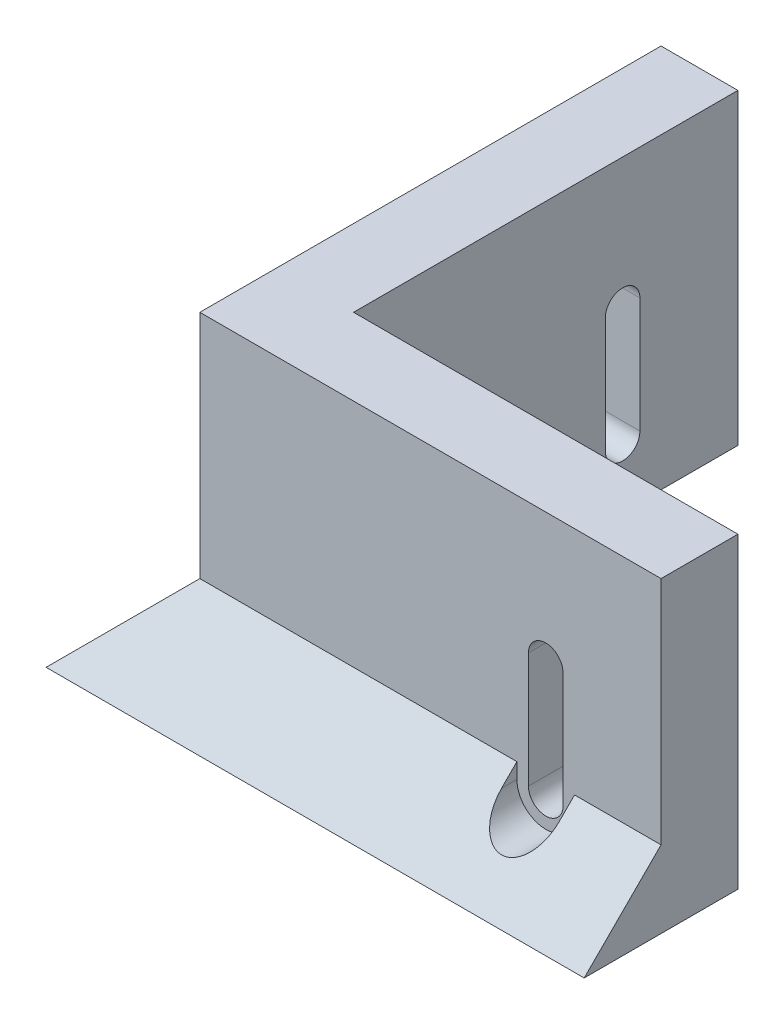
ISO-10303-21;
HEADER;
FILE_DESCRIPTION(('STEP AP214'),'2;1');
FILE_NAME('part.step','',(''),(''),'','','');
FILE_SCHEMA(('AUTOMOTIVE_DESIGN { 1 0 10303 214 1 1 1 1 }'));
ENDSEC;
DATA;
#1=APPLICATION_CONTEXT('core data for automotive mechanical design processes');
#2=APPLICATION_PROTOCOL_DEFINITION('international standard','automotive_design',2000,#1);
#3=PRODUCT_CONTEXT('',#1,'mechanical');
#4=PRODUCT('Part','Part','',(#3));
#5=PRODUCT_RELATED_PRODUCT_CATEGORY('part','',(#4));
#6=PRODUCT_DEFINITION_FORMATION('','',#4);
#7=PRODUCT_DEFINITION_CONTEXT('part definition',#1,'design');
#8=PRODUCT_DEFINITION('design','',#6,#7);
#9=PRODUCT_DEFINITION_SHAPE('','',#8);
#10=(LENGTH_UNIT() NAMED_UNIT(*) SI_UNIT(.MILLI.,.METRE.));
#11=(NAMED_UNIT(*) PLANE_ANGLE_UNIT() SI_UNIT($,.RADIAN.));
#12=(NAMED_UNIT(*) SI_UNIT($,.STERADIAN.) SOLID_ANGLE_UNIT());
#13=UNCERTAINTY_MEASURE_WITH_UNIT(LENGTH_MEASURE(1.E-05),#10,'distance_accuracy_value','');
#14=(GEOMETRIC_REPRESENTATION_CONTEXT(3) GLOBAL_UNCERTAINTY_ASSIGNED_CONTEXT((#13)) GLOBAL_UNIT_ASSIGNED_CONTEXT((#10,
#11,#12)) REPRESENTATION_CONTEXT('',''));
#15=CARTESIAN_POINT('',(0.,0.,0.));
#16=DIRECTION('',(0.,0.,1.));
#17=DIRECTION('',(1.,0.,0.));
#18=AXIS2_PLACEMENT_3D('',#15,#16,#17);
#19=CARTESIAN_POINT('',(-10.,40.,10.));
#20=DIRECTION('',(1.,0.,0.));
#21=DIRECTION('',(0.,0.,-1.));
#22=AXIS2_PLACEMENT_3D('',#19,#20,#21);
#23=PLANE('',#22);
#24=DIRECTION('',(0.,-1.,0.));
#25=VECTOR('',#24,1.);
#26=CARTESIAN_POINT('',(-10.,23.,-31.25));
#27=LINE('',#26,#25);
#28=CARTESIAN_POINT('',(-10.,9.99999999999995,-31.25));
#29=VERTEX_POINT('',#28);
#30=CARTESIAN_POINT('',(-10.,8.,-31.25));
#31=VERTEX_POINT('',#30);
#32=EDGE_CURVE('E199',#29,#31,#27,.T.);
#33=ORIENTED_EDGE('',*,*,#32,.F.);
#34=DIRECTION('',(0.,0.,-1.));
#35=VECTOR('',#34,1.);
#36=CARTESIAN_POINT('',(-10.,9.99999999999996,-50.));
#37=LINE('',#36,#35);
#38=CARTESIAN_POINT('',(-10.,9.99999999999996,10.));
#39=VERTEX_POINT('',#38);
#40=EDGE_CURVE('E316',#29,#39,#37,.F.);
#41=ORIENTED_EDGE('',*,*,#40,.T.);
#42=DIRECTION('',(0.,-1.,0.));
#43=VECTOR('',#42,1.);
#44=CARTESIAN_POINT('',(-10.,40.,10.));
#45=LINE('',#44,#43);
#46=CARTESIAN_POINT('',(-10.,40.,10.));
#47=VERTEX_POINT('',#46);
#48=EDGE_CURVE('E295',#47,#39,#45,.T.);
#49=ORIENTED_EDGE('',*,*,#48,.F.);
#50=DIRECTION('',(0.,0.,1.));
#51=VECTOR('',#50,1.);
#52=CARTESIAN_POINT('',(-10.,40.,10.));
#53=LINE('',#52,#51);
#54=CARTESIAN_POINT('',(-10.,40.,-50.));
#55=VERTEX_POINT('',#54);
#56=EDGE_CURVE('E275',#55,#47,#53,.T.);
#57=ORIENTED_EDGE('',*,*,#56,.F.);
#58=DIRECTION('',(0.,-1.,0.));
#59=VECTOR('',#58,1.);
#60=CARTESIAN_POINT('',(-10.,40.,-50.));
#61=LINE('',#60,#59);
#62=CARTESIAN_POINT('',(-10.,9.99999999999996,-50.));
#63=VERTEX_POINT('',#62);
#64=EDGE_CURVE('E298',#55,#63,#61,.T.);
#65=ORIENTED_EDGE('',*,*,#64,.T.);
#66=CARTESIAN_POINT('',(-10.,9.99999999999995,-38.75));
#67=VERTEX_POINT('',#66);
#68=EDGE_CURVE('E317',#63,#67,#37,.F.);
#69=ORIENTED_EDGE('',*,*,#68,.T.);
#70=DIRECTION('',(0.,1.,0.));
#71=VECTOR('',#70,1.);
#72=CARTESIAN_POINT('',(-10.,8.,-38.75));
#73=LINE('',#72,#71);
#74=CARTESIAN_POINT('',(-10.,8.,-38.75));
#75=VERTEX_POINT('',#74);
#76=EDGE_CURVE('E203',#75,#67,#73,.T.);
#77=ORIENTED_EDGE('',*,*,#76,.F.);
#78=CARTESIAN_POINT('',(-10.,8.,-35.));
#79=DIRECTION('',(1.,0.,0.));
#80=DIRECTION('',(0.,0.,-1.));
#81=AXIS2_PLACEMENT_3D('',#78,#79,#80);
#82=CIRCLE('',#81,3.75);
#83=EDGE_CURVE('E190',#31,#75,#82,.T.);
#84=ORIENTED_EDGE('',*,*,#83,.F.);
#85=EDGE_LOOP('',(#33,#41,#49,#57,#65,#69,#77,#84));
#86=FACE_BOUND('',#85,.T.);
#87=DIRECTION('',(0.,1.,0.));
#88=VECTOR('',#87,1.);
#89=CARTESIAN_POINT('',(-10.,23.,-37.25));
#90=LINE('',#89,#88);
#91=CARTESIAN_POINT('',(-10.,8.,-37.25));
#92=VERTEX_POINT('',#91);
#93=CARTESIAN_POINT('',(-10.,23.,-37.25));
#94=VERTEX_POINT('',#93);
#95=EDGE_CURVE('E213',#92,#94,#90,.T.);
#96=ORIENTED_EDGE('',*,*,#95,.T.);
#97=CARTESIAN_POINT('',(-10.,23.,-35.));
#98=DIRECTION('',(1.,0.,0.));
#99=DIRECTION('',(0.,0.,-1.));
#100=AXIS2_PLACEMENT_3D('',#97,#98,#99);
#101=CIRCLE('',#100,2.25);
#102=CARTESIAN_POINT('',(-10.,23.,-32.75));
#103=VERTEX_POINT('',#102);
#104=EDGE_CURVE('E195',#94,#103,#101,.T.);
#105=ORIENTED_EDGE('',*,*,#104,.T.);
#106=DIRECTION('',(0.,-1.,0.));
#107=VECTOR('',#106,1.);
#108=CARTESIAN_POINT('',(-10.,23.,-32.75));
#109=LINE('',#108,#107);
#110=CARTESIAN_POINT('',(-10.,8.,-32.75));
#111=VERTEX_POINT('',#110);
#112=EDGE_CURVE('E217',#103,#111,#109,.T.);
#113=ORIENTED_EDGE('',*,*,#112,.T.);
#114=CARTESIAN_POINT('',(-10.,8.,-35.));
#115=DIRECTION('',(1.,0.,0.));
#116=DIRECTION('',(0.,0.,-1.));
#117=AXIS2_PLACEMENT_3D('',#114,#115,#116);
#118=CIRCLE('',#117,2.25);
#119=EDGE_CURVE('E215',#111,#92,#118,.T.);
#120=ORIENTED_EDGE('',*,*,#119,.T.);
#121=EDGE_LOOP('',(#96,#105,#113,#120));
#122=FACE_BOUND('',#121,.T.);
#123=ADVANCED_FACE('F39',(#86,#122),#23,.F.);
#124=CARTESIAN_POINT('',(0.,40.,0.));
#125=DIRECTION('',(-1.,0.,0.));
#126=DIRECTION('',(0.,0.,1.));
#127=AXIS2_PLACEMENT_3D('',#124,#125,#126);
#128=PLANE('',#127);
#129=DIRECTION('',(0.,0.,-1.));
#130=VECTOR('',#129,1.);
#131=CARTESIAN_POINT('',(0.,0.,0.));
#132=LINE('',#131,#130);
#133=CARTESIAN_POINT('',(0.,0.,0.));
#134=VERTEX_POINT('',#133);
#135=CARTESIAN_POINT('',(0.,0.,-50.));
#136=VERTEX_POINT('',#135);
#137=EDGE_CURVE('E285',#134,#136,#132,.T.);
#138=ORIENTED_EDGE('',*,*,#137,.T.);
#139=DIRECTION('',(0.,-1.,0.));
#140=VECTOR('',#139,1.);
#141=CARTESIAN_POINT('',(0.,40.,-50.));
#142=LINE('',#141,#140);
#143=CARTESIAN_POINT('',(0.,40.,-50.));
#144=VERTEX_POINT('',#143);
#145=EDGE_CURVE('E300',#144,#136,#142,.T.);
#146=ORIENTED_EDGE('',*,*,#145,.F.);
#147=DIRECTION('',(0.,0.,-1.));
#148=VECTOR('',#147,1.);
#149=CARTESIAN_POINT('',(0.,40.,0.));
#150=LINE('',#149,#148);
#151=CARTESIAN_POINT('',(0.,40.,0.));
#152=VERTEX_POINT('',#151);
#153=EDGE_CURVE('E270',#152,#144,#150,.T.);
#154=ORIENTED_EDGE('',*,*,#153,.F.);
#155=DIRECTION('',(0.,-1.,0.));
#156=VECTOR('',#155,1.);
#157=CARTESIAN_POINT('',(0.,40.,0.));
#158=LINE('',#157,#156);
#159=EDGE_CURVE('E303',#152,#134,#158,.T.);
#160=ORIENTED_EDGE('',*,*,#159,.T.);
#161=EDGE_LOOP('',(#138,#146,#154,#160));
#162=FACE_BOUND('',#161,.T.);
#163=CARTESIAN_POINT('',(0.,23.,-35.));
#164=DIRECTION('',(-1.,0.,0.));
#165=DIRECTION('',(0.,0.,1.));
#166=AXIS2_PLACEMENT_3D('',#163,#164,#165);
#167=CIRCLE('',#166,2.25);
#168=CARTESIAN_POINT('',(0.,23.,-37.25));
#169=VERTEX_POINT('',#168);
#170=CARTESIAN_POINT('',(0.,23.,-32.75));
#171=VERTEX_POINT('',#170);
#172=EDGE_CURVE('E346',#169,#171,#167,.F.);
#173=ORIENTED_EDGE('',*,*,#172,.F.);
#174=DIRECTION('',(0.,1.,0.));
#175=VECTOR('',#174,1.);
#176=CARTESIAN_POINT('',(0.,40.,-37.25));
#177=LINE('',#176,#175);
#178=CARTESIAN_POINT('',(0.,8.,-37.25));
#179=VERTEX_POINT('',#178);
#180=EDGE_CURVE('E340',#179,#169,#177,.T.);
#181=ORIENTED_EDGE('',*,*,#180,.F.);
#182=CARTESIAN_POINT('',(0.,8.,-35.));
#183=DIRECTION('',(-1.,0.,0.));
#184=DIRECTION('',(0.,0.,1.));
#185=AXIS2_PLACEMENT_3D('',#182,#183,#184);
#186=CIRCLE('',#185,2.25);
#187=CARTESIAN_POINT('',(0.,8.,-32.75));
#188=VERTEX_POINT('',#187);
#189=EDGE_CURVE('E342',#188,#179,#186,.F.);
#190=ORIENTED_EDGE('',*,*,#189,.F.);
#191=DIRECTION('',(0.,-1.,0.));
#192=VECTOR('',#191,1.);
#193=CARTESIAN_POINT('',(0.,40.,-32.75));
#194=LINE('',#193,#192);
#195=EDGE_CURVE('E344',#171,#188,#194,.T.);
#196=ORIENTED_EDGE('',*,*,#195,.F.);
#197=EDGE_LOOP('',(#173,#181,#190,#196));
#198=FACE_BOUND('',#197,.T.);
#199=ADVANCED_FACE('F408',(#162,#198),#128,.F.);
#200=CARTESIAN_POINT('',(-20.,0.,20.));
#201=DIRECTION('',(0.,0.707106781186549,0.707106781186546));
#202=DIRECTION('',(0.,-0.707106781186546,0.707106781186549));
#203=AXIS2_PLACEMENT_3D('',#200,#201,#202);
#204=PLANE('',#203);
#205=DIRECTION('',(1.,0.,0.));
#206=VECTOR('',#205,1.);
#207=CARTESIAN_POINT('',(-10.,9.99999999999996,10.));
#208=LINE('',#207,#206);
#209=CARTESIAN_POINT('',(50.,9.99999999999996,10.));
#210=VERTEX_POINT('',#209);
#211=CARTESIAN_POINT('',(38.75,9.99999999999996,10.));
#212=VERTEX_POINT('',#211);
#213=EDGE_CURVE('E313',#210,#212,#208,.F.);
#214=ORIENTED_EDGE('',*,*,#213,.T.);
#215=DIRECTION('',(0.,-0.707106781186546,0.707106781186549));
#216=VECTOR('',#215,1.);
#217=CARTESIAN_POINT('',(38.75,0.,20.));
#218=LINE('',#217,#216);
#219=CARTESIAN_POINT('',(38.75,8.,12.));
#220=VERTEX_POINT('',#219);
#221=EDGE_CURVE('E337',#212,#220,#218,.T.);
#222=ORIENTED_EDGE('',*,*,#221,.T.);
#223=CARTESIAN_POINT('',(35.,8.,12.));
#224=DIRECTION('',(0.,0.707106781186549,0.707106781186546));
#225=DIRECTION('',(0.,0.707106781186546,-0.707106781186549));
#226=AXIS2_PLACEMENT_3D('',#223,#224,#225);
#227=ELLIPSE('',#226,5.30330085889912,3.75);
#228=CARTESIAN_POINT('',(31.25,8.,12.));
#229=VERTEX_POINT('',#228);
#230=EDGE_CURVE('E334',#220,#229,#227,.F.);
#231=ORIENTED_EDGE('',*,*,#230,.T.);
#232=DIRECTION('',(0.,0.707106781186546,-0.707106781186549));
#233=VECTOR('',#232,1.);
#234=CARTESIAN_POINT('',(31.25,0.,20.));
#235=LINE('',#234,#233);
#236=CARTESIAN_POINT('',(31.25,9.99999999999996,10.));
#237=VERTEX_POINT('',#236);
#238=EDGE_CURVE('E331',#229,#237,#235,.T.);
#239=ORIENTED_EDGE('',*,*,#238,.T.);
#240=EDGE_CURVE('E306',#237,#39,#208,.F.);
#241=ORIENTED_EDGE('',*,*,#240,.T.);
#242=DIRECTION('',(-0.577350269189627,-0.577350269189624,0.577350269189627));
#243=VECTOR('',#242,1.);
#244=CARTESIAN_POINT('',(-20.,0.,20.));
#245=LINE('',#244,#243);
#246=CARTESIAN_POINT('',(-20.,0.,20.));
#247=VERTEX_POINT('',#246);
#248=EDGE_CURVE('E307',#39,#247,#245,.T.);
#249=ORIENTED_EDGE('',*,*,#248,.T.);
#250=DIRECTION('',(-1.,0.,0.));
#251=VECTOR('',#250,1.);
#252=CARTESIAN_POINT('',(-20.,0.,20.));
#253=LINE('',#252,#251);
#254=CARTESIAN_POINT('',(50.,0.,20.));
#255=VERTEX_POINT('',#254);
#256=EDGE_CURVE('E255',#255,#247,#253,.T.);
#257=ORIENTED_EDGE('',*,*,#256,.F.);
#258=DIRECTION('',(0.,-0.707106781186546,0.707106781186549));
#259=VECTOR('',#258,1.);
#260=CARTESIAN_POINT('',(50.,0.,20.));
#261=LINE('',#260,#259);
#262=EDGE_CURVE('E266',#210,#255,#261,.T.);
#263=ORIENTED_EDGE('',*,*,#262,.F.);
#264=EDGE_LOOP('',(#214,#222,#231,#239,#241,#249,#257,#263));
#265=FACE_BOUND('',#264,.T.);
#266=ADVANCED_FACE('F41',(#265),#204,.T.);
#267=CARTESIAN_POINT('',(-10.,40.,10.));
#268=DIRECTION('',(0.,0.,-1.));
#269=DIRECTION('',(-1.,0.,0.));
#270=AXIS2_PLACEMENT_3D('',#267,#268,#269);
#271=PLANE('',#270);
#272=DIRECTION('',(0.,1.,0.));
#273=VECTOR('',#272,1.);
#274=CARTESIAN_POINT('',(38.75,8.,10.));
#275=LINE('',#274,#273);
#276=CARTESIAN_POINT('',(38.75,8.,10.));
#277=VERTEX_POINT('',#276);
#278=EDGE_CURVE('E231',#277,#212,#275,.T.);
#279=ORIENTED_EDGE('',*,*,#278,.T.);
#280=ORIENTED_EDGE('',*,*,#213,.F.);
#281=DIRECTION('',(0.,-1.,0.));
#282=VECTOR('',#281,1.);
#283=CARTESIAN_POINT('',(50.,40.,10.));
#284=LINE('',#283,#282);
#285=CARTESIAN_POINT('',(50.,40.,10.));
#286=VERTEX_POINT('',#285);
#287=EDGE_CURVE('E293',#286,#210,#284,.T.);
#288=ORIENTED_EDGE('',*,*,#287,.F.);
#289=DIRECTION('',(1.,0.,0.));
#290=VECTOR('',#289,1.);
#291=CARTESIAN_POINT('',(-10.,40.,10.));
#292=LINE('',#291,#290);
#293=EDGE_CURVE('E277',#47,#286,#292,.T.);
#294=ORIENTED_EDGE('',*,*,#293,.F.);
#295=ORIENTED_EDGE('',*,*,#48,.T.);
#296=ORIENTED_EDGE('',*,*,#240,.F.);
#297=DIRECTION('',(0.,-1.,0.));
#298=VECTOR('',#297,1.);
#299=CARTESIAN_POINT('',(31.25,23.,10.));
#300=LINE('',#299,#298);
#301=CARTESIAN_POINT('',(31.25,8.,10.));
#302=VERTEX_POINT('',#301);
#303=EDGE_CURVE('E234',#237,#302,#300,.T.);
#304=ORIENTED_EDGE('',*,*,#303,.T.);
#305=CARTESIAN_POINT('',(35.,8.,10.));
#306=DIRECTION('',(0.,0.,1.));
#307=DIRECTION('',(1.,0.,0.));
#308=AXIS2_PLACEMENT_3D('',#305,#306,#307);
#309=CIRCLE('',#308,3.75);
#310=EDGE_CURVE('E222',#302,#277,#309,.T.);
#311=ORIENTED_EDGE('',*,*,#310,.T.);
#312=EDGE_LOOP('',(#279,#280,#288,#294,#295,#296,#304,#311));
#313=FACE_BOUND('',#312,.T.);
#314=DIRECTION('',(0.,1.,0.));
#315=VECTOR('',#314,1.);
#316=CARTESIAN_POINT('',(37.25,23.,10.));
#317=LINE('',#316,#315);
#318=CARTESIAN_POINT('',(37.25,8.,10.));
#319=VERTEX_POINT('',#318);
#320=CARTESIAN_POINT('',(37.25,23.,10.));
#321=VERTEX_POINT('',#320);
#322=EDGE_CURVE('E249',#319,#321,#317,.T.);
#323=ORIENTED_EDGE('',*,*,#322,.F.);
#324=CARTESIAN_POINT('',(35.,8.,10.));
#325=DIRECTION('',(0.,0.,1.));
#326=DIRECTION('',(1.,0.,0.));
#327=AXIS2_PLACEMENT_3D('',#324,#325,#326);
#328=CIRCLE('',#327,2.25);
#329=CARTESIAN_POINT('',(32.75,8.,10.));
#330=VERTEX_POINT('',#329);
#331=EDGE_CURVE('E246',#330,#319,#328,.T.);
#332=ORIENTED_EDGE('',*,*,#331,.F.);
#333=DIRECTION('',(0.,-1.,0.));
#334=VECTOR('',#333,1.);
#335=CARTESIAN_POINT('',(32.75,23.,10.));
#336=LINE('',#335,#334);
#337=CARTESIAN_POINT('',(32.75,23.,10.));
#338=VERTEX_POINT('',#337);
#339=EDGE_CURVE('E244',#338,#330,#336,.T.);
#340=ORIENTED_EDGE('',*,*,#339,.F.);
#341=CARTESIAN_POINT('',(35.,23.,10.));
#342=DIRECTION('',(0.,0.,1.));
#343=DIRECTION('',(1.,0.,0.));
#344=AXIS2_PLACEMENT_3D('',#341,#342,#343);
#345=CIRCLE('',#344,2.25);
#346=EDGE_CURVE('E241',#321,#338,#345,.T.);
#347=ORIENTED_EDGE('',*,*,#346,.F.);
#348=EDGE_LOOP('',(#323,#332,#340,#347));
#349=FACE_BOUND('',#348,.T.);
#350=ADVANCED_FACE('F365',(#313,#349),#271,.F.);
#351=CARTESIAN_POINT('',(0.,40.,0.));
#352=DIRECTION('',(0.,0.,1.));
#353=DIRECTION('',(1.,0.,0.));
#354=AXIS2_PLACEMENT_3D('',#351,#352,#353);
#355=PLANE('',#354);
#356=DIRECTION('',(0.,1.,0.));
#357=VECTOR('',#356,1.);
#358=CARTESIAN_POINT('',(37.25,40.,0.));
#359=LINE('',#358,#357);
#360=CARTESIAN_POINT('',(37.25,8.,0.));
#361=VERTEX_POINT('',#360);
#362=CARTESIAN_POINT('',(37.25,23.,0.));
#363=VERTEX_POINT('',#362);
#364=EDGE_CURVE('E325',#361,#363,#359,.T.);
#365=ORIENTED_EDGE('',*,*,#364,.T.);
#366=CARTESIAN_POINT('',(35.,23.,0.));
#367=DIRECTION('',(0.,0.,1.));
#368=DIRECTION('',(1.,0.,0.));
#369=AXIS2_PLACEMENT_3D('',#366,#367,#368);
#370=CIRCLE('',#369,2.25);
#371=CARTESIAN_POINT('',(32.75,23.,0.));
#372=VERTEX_POINT('',#371);
#373=EDGE_CURVE('E328',#363,#372,#370,.T.);
#374=ORIENTED_EDGE('',*,*,#373,.T.);
#375=DIRECTION('',(0.,-1.,0.));
#376=VECTOR('',#375,1.);
#377=CARTESIAN_POINT('',(32.75,40.,0.));
#378=LINE('',#377,#376);
#379=CARTESIAN_POINT('',(32.75,8.,0.));
#380=VERTEX_POINT('',#379);
#381=EDGE_CURVE('E319',#372,#380,#378,.T.);
#382=ORIENTED_EDGE('',*,*,#381,.T.);
#383=CARTESIAN_POINT('',(35.,8.,0.));
#384=DIRECTION('',(0.,0.,1.));
#385=DIRECTION('',(1.,0.,0.));
#386=AXIS2_PLACEMENT_3D('',#383,#384,#385);
#387=CIRCLE('',#386,2.25);
#388=EDGE_CURVE('E322',#380,#361,#387,.T.);
#389=ORIENTED_EDGE('',*,*,#388,.T.);
#390=EDGE_LOOP('',(#365,#374,#382,#389));
#391=FACE_BOUND('',#390,.T.);
#392=DIRECTION('',(-1.,0.,0.));
#393=VECTOR('',#392,1.);
#394=CARTESIAN_POINT('',(0.,0.,0.));
#395=LINE('',#394,#393);
#396=CARTESIAN_POINT('',(50.,0.,0.));
#397=VERTEX_POINT('',#396);
#398=EDGE_CURVE('E282',#397,#134,#395,.T.);
#399=ORIENTED_EDGE('',*,*,#398,.T.);
#400=ORIENTED_EDGE('',*,*,#159,.F.);
#401=DIRECTION('',(-1.,0.,0.));
#402=VECTOR('',#401,1.);
#403=CARTESIAN_POINT('',(0.,40.,0.));
#404=LINE('',#403,#402);
#405=CARTESIAN_POINT('',(50.,40.,0.));
#406=VERTEX_POINT('',#405);
#407=EDGE_CURVE('E267',#406,#152,#404,.T.);
#408=ORIENTED_EDGE('',*,*,#407,.F.);
#409=DIRECTION('',(0.,-1.,0.));
#410=VECTOR('',#409,1.);
#411=CARTESIAN_POINT('',(50.,40.,0.));
#412=LINE('',#411,#410);
#413=EDGE_CURVE('E281',#406,#397,#412,.T.);
#414=ORIENTED_EDGE('',*,*,#413,.T.);
#415=EDGE_LOOP('',(#399,#400,#408,#414));
#416=FACE_BOUND('',#415,.T.);
#417=ADVANCED_FACE('F419',(#391,#416),#355,.F.);
#418=CARTESIAN_POINT('',(0.,40.,-50.));
#419=DIRECTION('',(0.,0.,1.));
#420=DIRECTION('',(1.,0.,0.));
#421=AXIS2_PLACEMENT_3D('',#418,#419,#420);
#422=PLANE('',#421);
#423=DIRECTION('',(-1.,0.,0.));
#424=VECTOR('',#423,1.);
#425=CARTESIAN_POINT('',(0.,0.,-50.));
#426=LINE('',#425,#424);
#427=CARTESIAN_POINT('',(-20.,0.,-50.));
#428=VERTEX_POINT('',#427);
#429=EDGE_CURVE('E288',#136,#428,#426,.T.);
#430=ORIENTED_EDGE('',*,*,#429,.T.);
#431=DIRECTION('',(-0.707106781186549,-0.707106781186546,0.));
#432=VECTOR('',#431,1.);
#433=CARTESIAN_POINT('',(10.,29.9999999999999,-50.));
#434=LINE('',#433,#432);
#435=EDGE_CURVE('E286',#63,#428,#434,.T.);
#436=ORIENTED_EDGE('',*,*,#435,.F.);
#437=ORIENTED_EDGE('',*,*,#64,.F.);
#438=DIRECTION('',(-1.,0.,0.));
#439=VECTOR('',#438,1.);
#440=CARTESIAN_POINT('',(0.,40.,-50.));
#441=LINE('',#440,#439);
#442=EDGE_CURVE('E273',#144,#55,#441,.T.);
#443=ORIENTED_EDGE('',*,*,#442,.F.);
#444=ORIENTED_EDGE('',*,*,#145,.T.);
#445=EDGE_LOOP('',(#430,#436,#437,#443,#444));
#446=FACE_BOUND('',#445,.T.);
#447=ADVANCED_FACE('F377',(#446),#422,.F.);
#448=CARTESIAN_POINT('',(50.,40.,0.));
#449=DIRECTION('',(-1.,0.,0.));
#450=DIRECTION('',(0.,0.,1.));
#451=AXIS2_PLACEMENT_3D('',#448,#449,#450);
#452=PLANE('',#451);
#453=DIRECTION('',(0.,0.,-1.));
#454=VECTOR('',#453,1.);
#455=CARTESIAN_POINT('',(50.,0.,0.));
#456=LINE('',#455,#454);
#457=EDGE_CURVE('E271',#255,#397,#456,.T.);
#458=ORIENTED_EDGE('',*,*,#457,.T.);
#459=ORIENTED_EDGE('',*,*,#413,.F.);
#460=DIRECTION('',(0.,0.,-1.));
#461=VECTOR('',#460,1.);
#462=CARTESIAN_POINT('',(50.,40.,0.));
#463=LINE('',#462,#461);
#464=EDGE_CURVE('E279',#286,#406,#463,.T.);
#465=ORIENTED_EDGE('',*,*,#464,.F.);
#466=ORIENTED_EDGE('',*,*,#287,.T.);
#467=ORIENTED_EDGE('',*,*,#262,.T.);
#468=EDGE_LOOP('',(#458,#459,#465,#466,#467));
#469=FACE_BOUND('',#468,.T.);
#470=ADVANCED_FACE('F385',(#469),#452,.F.);
#471=CARTESIAN_POINT('',(0.,40.,0.));
#472=DIRECTION('',(0.,-1.,0.));
#473=DIRECTION('',(0.,0.,-1.));
#474=AXIS2_PLACEMENT_3D('',#471,#472,#473);
#475=PLANE('',#474);
#476=ORIENTED_EDGE('',*,*,#407,.T.);
#477=ORIENTED_EDGE('',*,*,#153,.T.);
#478=ORIENTED_EDGE('',*,*,#442,.T.);
#479=ORIENTED_EDGE('',*,*,#56,.T.);
#480=ORIENTED_EDGE('',*,*,#293,.T.);
#481=ORIENTED_EDGE('',*,*,#464,.T.);
#482=EDGE_LOOP('',(#476,#477,#478,#479,#480,#481));
#483=FACE_BOUND('',#482,.T.);
#484=ADVANCED_FACE('F371',(#483),#475,.F.);
#485=CARTESIAN_POINT('',(0.,0.,0.));
#486=DIRECTION('',(0.,-1.,0.));
#487=DIRECTION('',(0.,0.,-1.));
#488=AXIS2_PLACEMENT_3D('',#485,#486,#487);
#489=PLANE('',#488);
#490=ORIENTED_EDGE('',*,*,#457,.F.);
#491=ORIENTED_EDGE('',*,*,#256,.T.);
#492=DIRECTION('',(0.,0.,-1.));
#493=VECTOR('',#492,1.);
#494=CARTESIAN_POINT('',(-20.,0.,-50.));
#495=LINE('',#494,#493);
#496=EDGE_CURVE('E263',#247,#428,#495,.T.);
#497=ORIENTED_EDGE('',*,*,#496,.T.);
#498=ORIENTED_EDGE('',*,*,#429,.F.);
#499=ORIENTED_EDGE('',*,*,#137,.F.);
#500=ORIENTED_EDGE('',*,*,#398,.F.);
#501=EDGE_LOOP('',(#490,#491,#497,#498,#499,#500));
#502=FACE_BOUND('',#501,.T.);
#503=ADVANCED_FACE('F381',(#502),#489,.T.);
#504=CARTESIAN_POINT('',(-20.,0.,-50.));
#505=DIRECTION('',(-0.707106781186546,0.707106781186549,0.));
#506=DIRECTION('',(-0.707106781186549,-0.707106781186546,0.));
#507=AXIS2_PLACEMENT_3D('',#504,#505,#506);
#508=PLANE('',#507);
#509=DIRECTION('',(0.707106781186549,0.707106781186546,0.));
#510=VECTOR('',#509,1.);
#511=CARTESIAN_POINT('',(-20.,0.,-31.25));
#512=LINE('',#511,#510);
#513=CARTESIAN_POINT('',(-12.,8.,-31.25));
#514=VERTEX_POINT('',#513);
#515=EDGE_CURVE('E11',#514,#29,#512,.T.);
#516=ORIENTED_EDGE('',*,*,#515,.F.);
#517=CARTESIAN_POINT('',(-12.,8.,-35.));
#518=DIRECTION('',(-0.707106781186546,0.707106781186549,0.));
#519=DIRECTION('',(0.707106781186549,0.707106781186546,0.));
#520=AXIS2_PLACEMENT_3D('',#517,#518,#519);
#521=ELLIPSE('',#520,5.30330085889912,3.75);
#522=CARTESIAN_POINT('',(-12.,8.,-38.75));
#523=VERTEX_POINT('',#522);
#524=EDGE_CURVE('E47',#523,#514,#521,.T.);
#525=ORIENTED_EDGE('',*,*,#524,.F.);
#526=DIRECTION('',(-0.707106781186549,-0.707106781186546,0.));
#527=VECTOR('',#526,1.);
#528=CARTESIAN_POINT('',(-20.,0.,-38.75));
#529=LINE('',#528,#527);
#530=EDGE_CURVE('E348',#67,#523,#529,.T.);
#531=ORIENTED_EDGE('',*,*,#530,.F.);
#532=ORIENTED_EDGE('',*,*,#68,.F.);
#533=ORIENTED_EDGE('',*,*,#435,.T.);
#534=ORIENTED_EDGE('',*,*,#496,.F.);
#535=ORIENTED_EDGE('',*,*,#248,.F.);
#536=ORIENTED_EDGE('',*,*,#40,.F.);
#537=EDGE_LOOP('',(#516,#525,#531,#532,#533,#534,#535,#536));
#538=FACE_BOUND('',#537,.T.);
#539=ADVANCED_FACE('F354',(#538),#508,.T.);
#540=CARTESIAN_POINT('',(35.,23.,-50.));
#541=DIRECTION('',(0.,0.,1.));
#542=DIRECTION('',(1.,0.,0.));
#543=AXIS2_PLACEMENT_3D('',#540,#541,#542);
#544=CYLINDRICAL_SURFACE('',#543,2.25);
#545=DIRECTION('',(0.,0.,1.));
#546=VECTOR('',#545,1.);
#547=CARTESIAN_POINT('',(37.25,23.,-50.));
#548=LINE('',#547,#546);
#549=EDGE_CURVE('E253',#363,#321,#548,.T.);
#550=ORIENTED_EDGE('',*,*,#549,.T.);
#551=ORIENTED_EDGE('',*,*,#346,.T.);
#552=DIRECTION('',(0.,0.,1.));
#553=VECTOR('',#552,1.);
#554=CARTESIAN_POINT('',(32.75,23.,-50.));
#555=LINE('',#554,#553);
#556=EDGE_CURVE('E252',#372,#338,#555,.T.);
#557=ORIENTED_EDGE('',*,*,#556,.F.);
#558=ORIENTED_EDGE('',*,*,#373,.F.);
#559=EDGE_LOOP('',(#550,#551,#557,#558));
#560=FACE_BOUND('',#559,.T.);
#561=ADVANCED_FACE('F424',(#560),#544,.F.);
#562=CARTESIAN_POINT('',(37.25,23.,-50.));
#563=DIRECTION('',(1.,0.,0.));
#564=DIRECTION('',(0.,0.,-1.));
#565=AXIS2_PLACEMENT_3D('',#562,#563,#564);
#566=PLANE('',#565);
#567=DIRECTION('',(0.,0.,1.));
#568=VECTOR('',#567,1.);
#569=CARTESIAN_POINT('',(37.25,8.,-50.));
#570=LINE('',#569,#568);
#571=EDGE_CURVE('E256',#361,#319,#570,.T.);
#572=ORIENTED_EDGE('',*,*,#571,.T.);
#573=ORIENTED_EDGE('',*,*,#322,.T.);
#574=ORIENTED_EDGE('',*,*,#549,.F.);
#575=ORIENTED_EDGE('',*,*,#364,.F.);
#576=EDGE_LOOP('',(#572,#573,#574,#575));
#577=FACE_BOUND('',#576,.T.);
#578=ADVANCED_FACE('F429',(#577),#566,.F.);
#579=CARTESIAN_POINT('',(35.,8.,-50.));
#580=DIRECTION('',(0.,0.,1.));
#581=DIRECTION('',(1.,0.,0.));
#582=AXIS2_PLACEMENT_3D('',#579,#580,#581);
#583=CYLINDRICAL_SURFACE('',#582,2.25);
#584=DIRECTION('',(0.,0.,1.));
#585=VECTOR('',#584,1.);
#586=CARTESIAN_POINT('',(32.75,8.,-50.));
#587=LINE('',#586,#585);
#588=EDGE_CURVE('E62',#380,#330,#587,.T.);
#589=ORIENTED_EDGE('',*,*,#588,.T.);
#590=ORIENTED_EDGE('',*,*,#331,.T.);
#591=ORIENTED_EDGE('',*,*,#571,.F.);
#592=ORIENTED_EDGE('',*,*,#388,.F.);
#593=EDGE_LOOP('',(#589,#590,#591,#592));
#594=FACE_BOUND('',#593,.T.);
#595=ADVANCED_FACE('F598',(#594),#583,.F.);
#596=CARTESIAN_POINT('',(32.75,23.,-50.));
#597=DIRECTION('',(-1.,0.,0.));
#598=DIRECTION('',(0.,-1.,0.));
#599=AXIS2_PLACEMENT_3D('',#596,#597,#598);
#600=PLANE('',#599);
#601=ORIENTED_EDGE('',*,*,#556,.T.);
#602=ORIENTED_EDGE('',*,*,#339,.T.);
#603=ORIENTED_EDGE('',*,*,#588,.F.);
#604=ORIENTED_EDGE('',*,*,#381,.F.);
#605=EDGE_LOOP('',(#601,#602,#603,#604));
#606=FACE_BOUND('',#605,.T.);
#607=ADVANCED_FACE('F493',(#606),#600,.F.);
#608=CARTESIAN_POINT('',(35.,8.,20.));
#609=DIRECTION('',(0.,0.,-1.));
#610=DIRECTION('',(-1.,0.,0.));
#611=AXIS2_PLACEMENT_3D('',#608,#609,#610);
#612=CYLINDRICAL_SURFACE('',#611,3.75);
#613=DIRECTION('',(0.,0.,-1.));
#614=VECTOR('',#613,1.);
#615=CARTESIAN_POINT('',(38.75,8.,20.));
#616=LINE('',#615,#614);
#617=EDGE_CURVE('E239',#220,#277,#616,.T.);
#618=ORIENTED_EDGE('',*,*,#617,.T.);
#619=ORIENTED_EDGE('',*,*,#310,.F.);
#620=DIRECTION('',(0.,0.,-1.));
#621=VECTOR('',#620,1.);
#622=CARTESIAN_POINT('',(31.25,8.,20.));
#623=LINE('',#622,#621);
#624=EDGE_CURVE('E237',#229,#302,#623,.T.);
#625=ORIENTED_EDGE('',*,*,#624,.F.);
#626=ORIENTED_EDGE('',*,*,#230,.F.);
#627=EDGE_LOOP('',(#618,#619,#625,#626));
#628=FACE_BOUND('',#627,.T.);
#629=ADVANCED_FACE('F393',(#628),#612,.F.);
#630=CARTESIAN_POINT('',(38.75,8.,20.));
#631=DIRECTION('',(-1.,0.,0.));
#632=DIRECTION('',(0.,0.,1.));
#633=AXIS2_PLACEMENT_3D('',#630,#631,#632);
#634=PLANE('',#633);
#635=ORIENTED_EDGE('',*,*,#278,.F.);
#636=ORIENTED_EDGE('',*,*,#617,.F.);
#637=ORIENTED_EDGE('',*,*,#221,.F.);
#638=EDGE_LOOP('',(#635,#636,#637));
#639=FACE_BOUND('',#638,.T.);
#640=ADVANCED_FACE('F390',(#639),#634,.T.);
#641=CARTESIAN_POINT('',(31.25,23.,20.));
#642=DIRECTION('',(1.,0.,0.));
#643=DIRECTION('',(0.,0.,-1.));
#644=AXIS2_PLACEMENT_3D('',#641,#642,#643);
#645=PLANE('',#644);
#646=ORIENTED_EDGE('',*,*,#624,.T.);
#647=ORIENTED_EDGE('',*,*,#303,.F.);
#648=ORIENTED_EDGE('',*,*,#238,.F.);
#649=EDGE_LOOP('',(#646,#647,#648));
#650=FACE_BOUND('',#649,.T.);
#651=ADVANCED_FACE('F395',(#650),#645,.T.);
#652=CARTESIAN_POINT('',(50.,23.,-35.));
#653=DIRECTION('',(-1.,0.,0.));
#654=DIRECTION('',(0.,0.,1.));
#655=AXIS2_PLACEMENT_3D('',#652,#653,#654);
#656=CYLINDRICAL_SURFACE('',#655,2.25);
#657=ORIENTED_EDGE('',*,*,#172,.T.);
#658=DIRECTION('',(-1.,0.,0.));
#659=VECTOR('',#658,1.);
#660=CARTESIAN_POINT('',(50.,23.,-32.75));
#661=LINE('',#660,#659);
#662=EDGE_CURVE('E220',#171,#103,#661,.T.);
#663=ORIENTED_EDGE('',*,*,#662,.T.);
#664=ORIENTED_EDGE('',*,*,#104,.F.);
#665=DIRECTION('',(-1.,0.,0.));
#666=VECTOR('',#665,1.);
#667=CARTESIAN_POINT('',(50.,23.,-37.25));
#668=LINE('',#667,#666);
#669=EDGE_CURVE('E219',#169,#94,#668,.T.);
#670=ORIENTED_EDGE('',*,*,#669,.F.);
#671=EDGE_LOOP('',(#657,#663,#664,#670));
#672=FACE_BOUND('',#671,.T.);
#673=ADVANCED_FACE('F397',(#672),#656,.F.);
#674=CARTESIAN_POINT('',(50.,23.,-32.75));
#675=DIRECTION('',(0.,0.,-1.));
#676=DIRECTION('',(0.,1.,0.));
#677=AXIS2_PLACEMENT_3D('',#674,#675,#676);
#678=PLANE('',#677);
#679=ORIENTED_EDGE('',*,*,#195,.T.);
#680=DIRECTION('',(-1.,0.,0.));
#681=VECTOR('',#680,1.);
#682=CARTESIAN_POINT('',(50.,8.,-32.75));
#683=LINE('',#682,#681);
#684=EDGE_CURVE('E223',#188,#111,#683,.T.);
#685=ORIENTED_EDGE('',*,*,#684,.T.);
#686=ORIENTED_EDGE('',*,*,#112,.F.);
#687=ORIENTED_EDGE('',*,*,#662,.F.);
#688=EDGE_LOOP('',(#679,#685,#686,#687));
#689=FACE_BOUND('',#688,.T.);
#690=ADVANCED_FACE('F403',(#689),#678,.T.);
#691=CARTESIAN_POINT('',(50.,8.,-35.));
#692=DIRECTION('',(-1.,0.,0.));
#693=DIRECTION('',(0.,0.,1.));
#694=AXIS2_PLACEMENT_3D('',#691,#692,#693);
#695=CYLINDRICAL_SURFACE('',#694,2.25);
#696=ORIENTED_EDGE('',*,*,#189,.T.);
#697=DIRECTION('',(-1.,0.,0.));
#698=VECTOR('',#697,1.);
#699=CARTESIAN_POINT('',(50.,8.,-37.25));
#700=LINE('',#699,#698);
#701=EDGE_CURVE('E54',#179,#92,#700,.T.);
#702=ORIENTED_EDGE('',*,*,#701,.T.);
#703=ORIENTED_EDGE('',*,*,#119,.F.);
#704=ORIENTED_EDGE('',*,*,#684,.F.);
#705=EDGE_LOOP('',(#696,#702,#703,#704));
#706=FACE_BOUND('',#705,.T.);
#707=ADVANCED_FACE('F529',(#706),#695,.F.);
#708=CARTESIAN_POINT('',(50.,23.,-37.25));
#709=DIRECTION('',(0.,0.,1.));
#710=DIRECTION('',(1.,0.,0.));
#711=AXIS2_PLACEMENT_3D('',#708,#709,#710);
#712=PLANE('',#711);
#713=ORIENTED_EDGE('',*,*,#180,.T.);
#714=ORIENTED_EDGE('',*,*,#669,.T.);
#715=ORIENTED_EDGE('',*,*,#95,.F.);
#716=ORIENTED_EDGE('',*,*,#701,.F.);
#717=EDGE_LOOP('',(#713,#714,#715,#716));
#718=FACE_BOUND('',#717,.T.);
#719=ADVANCED_FACE('F537',(#718),#712,.T.);
#720=CARTESIAN_POINT('',(-20.,8.,-35.));
#721=DIRECTION('',(1.,0.,0.));
#722=DIRECTION('',(0.,0.,-1.));
#723=AXIS2_PLACEMENT_3D('',#720,#721,#722);
#724=CYLINDRICAL_SURFACE('',#723,3.75);
#725=ORIENTED_EDGE('',*,*,#524,.T.);
#726=DIRECTION('',(1.,0.,0.));
#727=VECTOR('',#726,1.);
#728=CARTESIAN_POINT('',(-20.,8.,-31.25));
#729=LINE('',#728,#727);
#730=EDGE_CURVE('E185',#514,#31,#729,.T.);
#731=ORIENTED_EDGE('',*,*,#730,.T.);
#732=ORIENTED_EDGE('',*,*,#83,.T.);
#733=DIRECTION('',(1.,0.,0.));
#734=VECTOR('',#733,1.);
#735=CARTESIAN_POINT('',(-20.,8.,-38.75));
#736=LINE('',#735,#734);
#737=EDGE_CURVE('E196',#523,#75,#736,.T.);
#738=ORIENTED_EDGE('',*,*,#737,.F.);
#739=EDGE_LOOP('',(#725,#731,#732,#738));
#740=FACE_BOUND('',#739,.T.);
#741=ADVANCED_FACE('F187',(#740),#724,.F.);
#742=CARTESIAN_POINT('',(-20.,23.,-31.25));
#743=DIRECTION('',(0.,0.,1.));
#744=DIRECTION('',(1.,0.,0.));
#745=AXIS2_PLACEMENT_3D('',#742,#743,#744);
#746=PLANE('',#745);
#747=ORIENTED_EDGE('',*,*,#515,.T.);
#748=ORIENTED_EDGE('',*,*,#32,.T.);
#749=ORIENTED_EDGE('',*,*,#730,.F.);
#750=EDGE_LOOP('',(#747,#748,#749));
#751=FACE_BOUND('',#750,.T.);
#752=ADVANCED_FACE('F200',(#751),#746,.F.);
#753=CARTESIAN_POINT('',(-20.,8.,-38.75));
#754=DIRECTION('',(0.,0.,-1.));
#755=DIRECTION('',(-1.,0.,0.));
#756=AXIS2_PLACEMENT_3D('',#753,#754,#755);
#757=PLANE('',#756);
#758=ORIENTED_EDGE('',*,*,#530,.T.);
#759=ORIENTED_EDGE('',*,*,#737,.T.);
#760=ORIENTED_EDGE('',*,*,#76,.T.);
#761=EDGE_LOOP('',(#758,#759,#760));
#762=FACE_BOUND('',#761,.T.);
#763=ADVANCED_FACE('F351',(#762),#757,.F.);
#764=CLOSED_SHELL('',(#123,#199,#266,#350,#417,#447,#470,#484,#503,#539,#561,#578,#595,#607,
#629,#640,#651,#673,#690,#707,#719,#741,#752,#763));
#765=MANIFOLD_SOLID_BREP('B2',#764);
#766=ADVANCED_BREP_SHAPE_REPRESENTATION('',(#18,#765),#14);
#767=SHAPE_DEFINITION_REPRESENTATION(#9,#766);
ENDSEC;
END-ISO-10303-21;
